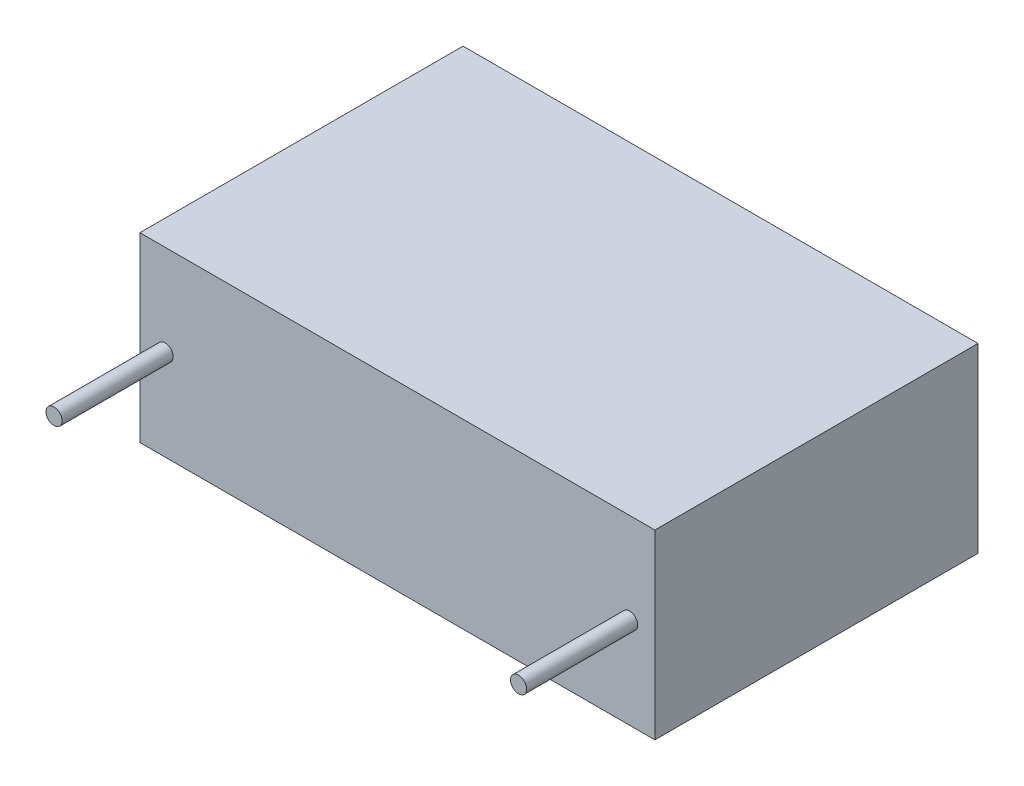
ISO-10303-21;
HEADER;
FILE_DESCRIPTION(('STEP AP214'),'2;1');
FILE_NAME('part.step','',(''),(''),'','','');
FILE_SCHEMA(('AUTOMOTIVE_DESIGN { 1 0 10303 214 1 1 1 1 }'));
ENDSEC;
DATA;
#1=APPLICATION_CONTEXT('core data for automotive mechanical design processes');
#2=APPLICATION_PROTOCOL_DEFINITION('international standard','automotive_design',2000,#1);
#3=PRODUCT_CONTEXT('',#1,'mechanical');
#4=PRODUCT('Part','Part','',(#3));
#5=PRODUCT_RELATED_PRODUCT_CATEGORY('part','',(#4));
#6=PRODUCT_DEFINITION_FORMATION('','',#4);
#7=PRODUCT_DEFINITION_CONTEXT('part definition',#1,'design');
#8=PRODUCT_DEFINITION('design','',#6,#7);
#9=PRODUCT_DEFINITION_SHAPE('','',#8);
#10=(LENGTH_UNIT() NAMED_UNIT(*) SI_UNIT(.MILLI.,.METRE.));
#11=(NAMED_UNIT(*) PLANE_ANGLE_UNIT() SI_UNIT($,.RADIAN.));
#12=(NAMED_UNIT(*) SI_UNIT($,.STERADIAN.) SOLID_ANGLE_UNIT());
#13=UNCERTAINTY_MEASURE_WITH_UNIT(LENGTH_MEASURE(1.E-05),#10,'distance_accuracy_value','');
#14=(GEOMETRIC_REPRESENTATION_CONTEXT(3) GLOBAL_UNCERTAINTY_ASSIGNED_CONTEXT((#13)) GLOBAL_UNIT_ASSIGNED_CONTEXT((#10,
#11,#12)) REPRESENTATION_CONTEXT('',''));
#15=CARTESIAN_POINT('',(0.,0.,0.));
#16=DIRECTION('',(0.,0.,1.));
#17=DIRECTION('',(1.,0.,0.));
#18=AXIS2_PLACEMENT_3D('',#15,#16,#17);
#19=CARTESIAN_POINT('',(0.,9.,16.));
#20=DIRECTION('',(0.,0.,-1.));
#21=DIRECTION('',(-1.,0.,0.));
#22=AXIS2_PLACEMENT_3D('',#19,#20,#21);
#23=PLANE('',#22);
#24=CARTESIAN_POINT('',(1.25,4.5,16.));
#25=DIRECTION('',(0.,0.,-1.));
#26=DIRECTION('',(-1.,0.,0.));
#27=AXIS2_PLACEMENT_3D('',#24,#25,#26);
#28=CIRCLE('',#27,0.4);
#29=CARTESIAN_POINT('',(0.85,4.5,16.));
#30=VERTEX_POINT('',#29);
#31=EDGE_CURVE('E39',#30,#30,#28,.F.);
#32=ORIENTED_EDGE('',*,*,#31,.F.);
#33=EDGE_LOOP('',(#32));
#34=FACE_BOUND('',#33,.T.);
#35=DIRECTION('',(0.,-1.,0.));
#36=VECTOR('',#35,1.);
#37=CARTESIAN_POINT('',(0.,0.,16.));
#38=LINE('',#37,#36);
#39=CARTESIAN_POINT('',(0.,9.,16.));
#40=VERTEX_POINT('',#39);
#41=CARTESIAN_POINT('',(0.,0.,16.));
#42=VERTEX_POINT('',#41);
#43=EDGE_CURVE('E103',#40,#42,#38,.T.);
#44=ORIENTED_EDGE('',*,*,#43,.T.);
#45=DIRECTION('',(1.,0.,0.));
#46=VECTOR('',#45,1.);
#47=CARTESIAN_POINT('',(0.,0.,16.));
#48=LINE('',#47,#46);
#49=CARTESIAN_POINT('',(25.5,0.,16.));
#50=VERTEX_POINT('',#49);
#51=EDGE_CURVE('E86',#42,#50,#48,.T.);
#52=ORIENTED_EDGE('',*,*,#51,.T.);
#53=DIRECTION('',(0.,1.,0.));
#54=VECTOR('',#53,1.);
#55=CARTESIAN_POINT('',(25.5,0.,16.));
#56=LINE('',#55,#54);
#57=CARTESIAN_POINT('',(25.5,9.,16.));
#58=VERTEX_POINT('',#57);
#59=EDGE_CURVE('E51',#50,#58,#56,.T.);
#60=ORIENTED_EDGE('',*,*,#59,.T.);
#61=DIRECTION('',(-1.,0.,0.));
#62=VECTOR('',#61,1.);
#63=CARTESIAN_POINT('',(0.,9.,16.));
#64=LINE('',#63,#62);
#65=EDGE_CURVE('E46',#58,#40,#64,.T.);
#66=ORIENTED_EDGE('',*,*,#65,.T.);
#67=EDGE_LOOP('',(#44,#52,#60,#66));
#68=FACE_BOUND('',#67,.T.);
#69=CARTESIAN_POINT('',(24.25,4.5,16.));
#70=DIRECTION('',(0.,0.,-1.));
#71=DIRECTION('',(-1.,0.,0.));
#72=AXIS2_PLACEMENT_3D('',#69,#70,#71);
#73=CIRCLE('',#72,0.400000000000001);
#74=CARTESIAN_POINT('',(23.85,4.5,16.));
#75=VERTEX_POINT('',#74);
#76=EDGE_CURVE('E11',#75,#75,#73,.F.);
#77=ORIENTED_EDGE('',*,*,#76,.F.);
#78=EDGE_LOOP('',(#77));
#79=FACE_BOUND('',#78,.T.);
#80=ADVANCED_FACE('F31',(#34,#68,#79),#23,.F.);
#81=CARTESIAN_POINT('',(0.,0.,16.));
#82=DIRECTION('',(1.,0.,0.));
#83=DIRECTION('',(0.,0.,-1.));
#84=AXIS2_PLACEMENT_3D('',#81,#82,#83);
#85=PLANE('',#84);
#86=DIRECTION('',(0.,-1.,0.));
#87=VECTOR('',#86,1.);
#88=CARTESIAN_POINT('',(0.,0.,0.));
#89=LINE('',#88,#87);
#90=CARTESIAN_POINT('',(0.,9.,0.));
#91=VERTEX_POINT('',#90);
#92=CARTESIAN_POINT('',(0.,0.,0.));
#93=VERTEX_POINT('',#92);
#94=EDGE_CURVE('E77',#91,#93,#89,.T.);
#95=ORIENTED_EDGE('',*,*,#94,.T.);
#96=DIRECTION('',(0.,0.,-1.));
#97=VECTOR('',#96,1.);
#98=CARTESIAN_POINT('',(0.,0.,16.));
#99=LINE('',#98,#97);
#100=EDGE_CURVE('E84',#42,#93,#99,.T.);
#101=ORIENTED_EDGE('',*,*,#100,.F.);
#102=ORIENTED_EDGE('',*,*,#43,.F.);
#103=DIRECTION('',(0.,0.,-1.));
#104=VECTOR('',#103,1.);
#105=CARTESIAN_POINT('',(0.,9.,16.));
#106=LINE('',#105,#104);
#107=EDGE_CURVE('E92',#40,#91,#106,.T.);
#108=ORIENTED_EDGE('',*,*,#107,.T.);
#109=EDGE_LOOP('',(#95,#101,#102,#108));
#110=FACE_BOUND('',#109,.T.);
#111=ADVANCED_FACE('F33',(#110),#85,.F.);
#112=CARTESIAN_POINT('',(0.,0.,16.));
#113=DIRECTION('',(0.,1.,0.));
#114=DIRECTION('',(0.,0.,1.));
#115=AXIS2_PLACEMENT_3D('',#112,#113,#114);
#116=PLANE('',#115);
#117=DIRECTION('',(1.,0.,0.));
#118=VECTOR('',#117,1.);
#119=CARTESIAN_POINT('',(0.,0.,0.));
#120=LINE('',#119,#118);
#121=CARTESIAN_POINT('',(25.5,0.,0.));
#122=VERTEX_POINT('',#121);
#123=EDGE_CURVE('E72',#93,#122,#120,.T.);
#124=ORIENTED_EDGE('',*,*,#123,.T.);
#125=DIRECTION('',(0.,0.,-1.));
#126=VECTOR('',#125,1.);
#127=CARTESIAN_POINT('',(25.5,0.,16.));
#128=LINE('',#127,#126);
#129=EDGE_CURVE('E89',#50,#122,#128,.T.);
#130=ORIENTED_EDGE('',*,*,#129,.F.);
#131=ORIENTED_EDGE('',*,*,#51,.F.);
#132=ORIENTED_EDGE('',*,*,#100,.T.);
#133=EDGE_LOOP('',(#124,#130,#131,#132));
#134=FACE_BOUND('',#133,.T.);
#135=ADVANCED_FACE('F85',(#134),#116,.F.);
#136=CARTESIAN_POINT('',(25.5,0.,16.));
#137=DIRECTION('',(-1.,0.,0.));
#138=DIRECTION('',(0.,0.,1.));
#139=AXIS2_PLACEMENT_3D('',#136,#137,#138);
#140=PLANE('',#139);
#141=DIRECTION('',(0.,1.,0.));
#142=VECTOR('',#141,1.);
#143=CARTESIAN_POINT('',(25.5,0.,0.));
#144=LINE('',#143,#142);
#145=CARTESIAN_POINT('',(25.5,9.,0.));
#146=VERTEX_POINT('',#145);
#147=EDGE_CURVE('E78',#122,#146,#144,.T.);
#148=ORIENTED_EDGE('',*,*,#147,.T.);
#149=DIRECTION('',(0.,0.,-1.));
#150=VECTOR('',#149,1.);
#151=CARTESIAN_POINT('',(25.5,9.,16.));
#152=LINE('',#151,#150);
#153=EDGE_CURVE('E109',#58,#146,#152,.T.);
#154=ORIENTED_EDGE('',*,*,#153,.F.);
#155=ORIENTED_EDGE('',*,*,#59,.F.);
#156=ORIENTED_EDGE('',*,*,#129,.T.);
#157=EDGE_LOOP('',(#148,#154,#155,#156));
#158=FACE_BOUND('',#157,.T.);
#159=ADVANCED_FACE('F146',(#158),#140,.F.);
#160=CARTESIAN_POINT('',(0.,9.,16.));
#161=DIRECTION('',(0.,-1.,0.));
#162=DIRECTION('',(0.,0.,-1.));
#163=AXIS2_PLACEMENT_3D('',#160,#161,#162);
#164=PLANE('',#163);
#165=DIRECTION('',(-1.,0.,0.));
#166=VECTOR('',#165,1.);
#167=CARTESIAN_POINT('',(0.,9.,0.));
#168=LINE('',#167,#166);
#169=EDGE_CURVE('E101',#146,#91,#168,.T.);
#170=ORIENTED_EDGE('',*,*,#169,.T.);
#171=ORIENTED_EDGE('',*,*,#107,.F.);
#172=ORIENTED_EDGE('',*,*,#65,.F.);
#173=ORIENTED_EDGE('',*,*,#153,.T.);
#174=EDGE_LOOP('',(#170,#171,#172,#173));
#175=FACE_BOUND('',#174,.T.);
#176=ADVANCED_FACE('F142',(#175),#164,.F.);
#177=CARTESIAN_POINT('',(0.,9.,0.));
#178=DIRECTION('',(0.,0.,-1.));
#179=DIRECTION('',(-1.,0.,0.));
#180=AXIS2_PLACEMENT_3D('',#177,#178,#179);
#181=PLANE('',#180);
#182=ORIENTED_EDGE('',*,*,#94,.F.);
#183=ORIENTED_EDGE('',*,*,#169,.F.);
#184=ORIENTED_EDGE('',*,*,#147,.F.);
#185=ORIENTED_EDGE('',*,*,#123,.F.);
#186=EDGE_LOOP('',(#182,#183,#184,#185));
#187=FACE_BOUND('',#186,.T.);
#188=ADVANCED_FACE('F74',(#187),#181,.T.);
#189=CARTESIAN_POINT('',(1.25,4.5,21.5));
#190=DIRECTION('',(0.,0.,-1.));
#191=DIRECTION('',(-1.,0.,0.));
#192=AXIS2_PLACEMENT_3D('',#189,#190,#191);
#193=CYLINDRICAL_SURFACE('',#192,0.4);
#194=CARTESIAN_POINT('',(1.25,4.5,21.5));
#195=DIRECTION('',(0.,0.,1.));
#196=DIRECTION('',(1.,0.,0.));
#197=AXIS2_PLACEMENT_3D('',#194,#195,#196);
#198=CIRCLE('',#197,0.4);
#199=CARTESIAN_POINT('',(1.65,4.5,21.5));
#200=VERTEX_POINT('',#199);
#201=EDGE_CURVE('E93',#200,#200,#198,.T.);
#202=ORIENTED_EDGE('',*,*,#201,.F.);
#203=EDGE_LOOP('',(#202));
#204=FACE_BOUND('',#203,.T.);
#205=ORIENTED_EDGE('',*,*,#31,.T.);
#206=EDGE_LOOP('',(#205));
#207=FACE_BOUND('',#206,.T.);
#208=ADVANCED_FACE('F115',(#204,#207),#193,.T.);
#209=CARTESIAN_POINT('',(1.25,4.5,21.5));
#210=DIRECTION('',(0.,0.,1.));
#211=DIRECTION('',(1.,0.,0.));
#212=AXIS2_PLACEMENT_3D('',#209,#210,#211);
#213=PLANE('',#212);
#214=ORIENTED_EDGE('',*,*,#201,.T.);
#215=EDGE_LOOP('',(#214));
#216=FACE_BOUND('',#215,.T.);
#217=ADVANCED_FACE('F125',(#216),#213,.T.);
#218=CARTESIAN_POINT('',(24.25,4.5,21.5));
#219=DIRECTION('',(0.,0.,-1.));
#220=DIRECTION('',(-1.,0.,0.));
#221=AXIS2_PLACEMENT_3D('',#218,#219,#220);
#222=CYLINDRICAL_SURFACE('',#221,0.400000000000001);
#223=CARTESIAN_POINT('',(24.25,4.5,21.5));
#224=DIRECTION('',(0.,0.,1.));
#225=DIRECTION('',(1.,0.,0.));
#226=AXIS2_PLACEMENT_3D('',#223,#224,#225);
#227=CIRCLE('',#226,0.400000000000001);
#228=CARTESIAN_POINT('',(24.65,4.5,21.5));
#229=VERTEX_POINT('',#228);
#230=EDGE_CURVE('E96',#229,#229,#227,.T.);
#231=ORIENTED_EDGE('',*,*,#230,.F.);
#232=EDGE_LOOP('',(#231));
#233=FACE_BOUND('',#232,.T.);
#234=ORIENTED_EDGE('',*,*,#76,.T.);
#235=EDGE_LOOP('',(#234));
#236=FACE_BOUND('',#235,.T.);
#237=ADVANCED_FACE('F122',(#233,#236),#222,.T.);
#238=CARTESIAN_POINT('',(24.25,4.5,21.5));
#239=DIRECTION('',(0.,0.,1.));
#240=DIRECTION('',(1.,0.,0.));
#241=AXIS2_PLACEMENT_3D('',#238,#239,#240);
#242=PLANE('',#241);
#243=ORIENTED_EDGE('',*,*,#230,.T.);
#244=EDGE_LOOP('',(#243));
#245=FACE_BOUND('',#244,.T.);
#246=ADVANCED_FACE('F124',(#245),#242,.T.);
#247=CLOSED_SHELL('',(#80,#111,#135,#159,#176,#188,#208,#217,#237,#246));
#248=MANIFOLD_SOLID_BREP('B2',#247);
#249=ADVANCED_BREP_SHAPE_REPRESENTATION('',(#18,#248),#14);
#250=SHAPE_DEFINITION_REPRESENTATION(#9,#249);
ENDSEC;
END-ISO-10303-21;
